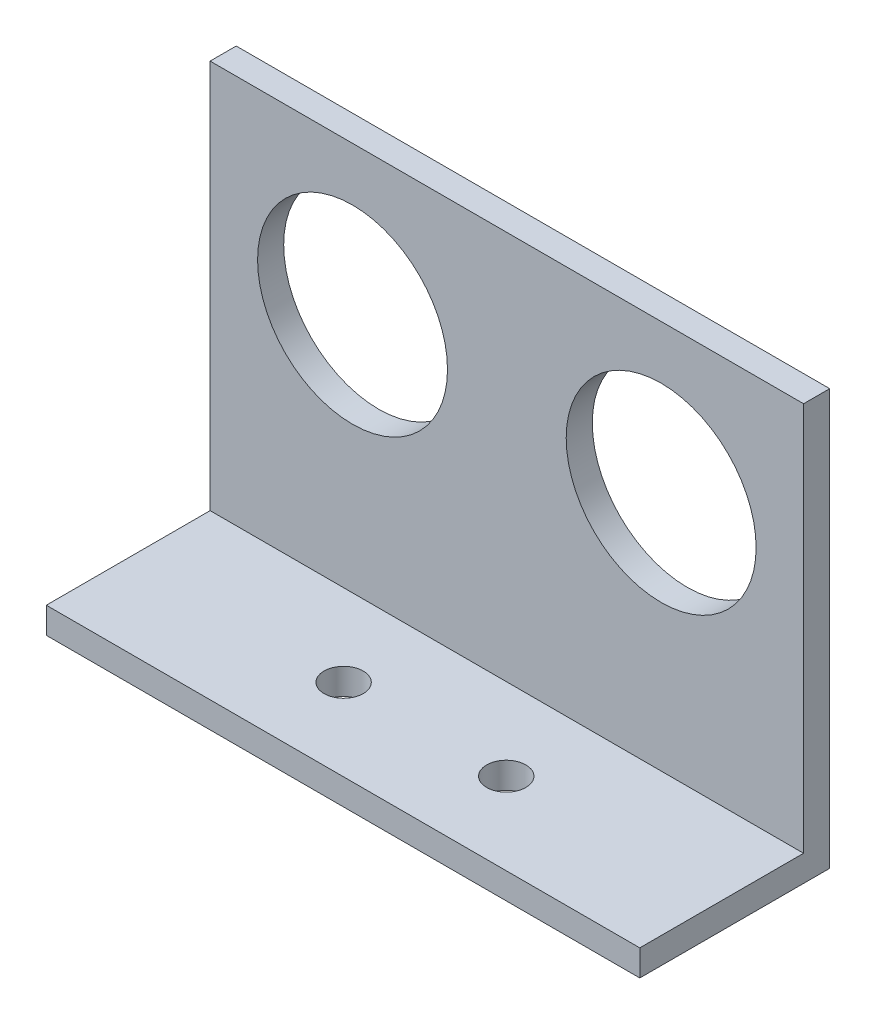
ISO-10303-21;
HEADER;
FILE_DESCRIPTION(('STEP AP214'),'2;1');
FILE_NAME('part.step','',(''),(''),'','','');
FILE_SCHEMA(('AUTOMOTIVE_DESIGN { 1 0 10303 214 1 1 1 1 }'));
ENDSEC;
DATA;
#1=APPLICATION_CONTEXT('core data for automotive mechanical design processes');
#2=APPLICATION_PROTOCOL_DEFINITION('international standard','automotive_design',2000,#1);
#3=PRODUCT_CONTEXT('',#1,'mechanical');
#4=PRODUCT('Part','Part','',(#3));
#5=PRODUCT_RELATED_PRODUCT_CATEGORY('part','',(#4));
#6=PRODUCT_DEFINITION_FORMATION('','',#4);
#7=PRODUCT_DEFINITION_CONTEXT('part definition',#1,'design');
#8=PRODUCT_DEFINITION('design','',#6,#7);
#9=PRODUCT_DEFINITION_SHAPE('','',#8);
#10=(LENGTH_UNIT() NAMED_UNIT(*) SI_UNIT(.MILLI.,.METRE.));
#11=(NAMED_UNIT(*) PLANE_ANGLE_UNIT() SI_UNIT($,.RADIAN.));
#12=(NAMED_UNIT(*) SI_UNIT($,.STERADIAN.) SOLID_ANGLE_UNIT());
#13=UNCERTAINTY_MEASURE_WITH_UNIT(LENGTH_MEASURE(1.E-05),#10,'distance_accuracy_value','');
#14=(GEOMETRIC_REPRESENTATION_CONTEXT(3) GLOBAL_UNCERTAINTY_ASSIGNED_CONTEXT((#13)) GLOBAL_UNIT_ASSIGNED_CONTEXT((#10,
#11,#12)) REPRESENTATION_CONTEXT('',''));
#15=CARTESIAN_POINT('',(0.,0.,0.));
#16=DIRECTION('',(0.,0.,1.));
#17=DIRECTION('',(1.,0.,0.));
#18=AXIS2_PLACEMENT_3D('',#15,#16,#17);
#19=CARTESIAN_POINT('',(0.,35.,2.2));
#20=DIRECTION('',(1.,0.,0.));
#21=DIRECTION('',(0.,0.,-1.));
#22=AXIS2_PLACEMENT_3D('',#19,#20,#21);
#23=PLANE('',#22);
#24=DIRECTION('',(0.,-1.,0.));
#25=VECTOR('',#24,1.);
#26=CARTESIAN_POINT('',(0.,35.,0.));
#27=LINE('',#26,#25);
#28=CARTESIAN_POINT('',(0.,35.,0.));
#29=VERTEX_POINT('',#28);
#30=CARTESIAN_POINT('',(0.,0.,0.));
#31=VERTEX_POINT('',#30);
#32=EDGE_CURVE('E96',#29,#31,#27,.T.);
#33=ORIENTED_EDGE('',*,*,#32,.T.);
#34=DIRECTION('',(0.,0.,-1.));
#35=VECTOR('',#34,1.);
#36=CARTESIAN_POINT('',(0.,0.,2.2));
#37=LINE('',#36,#35);
#38=CARTESIAN_POINT('',(0.,0.,16.));
#39=VERTEX_POINT('',#38);
#40=EDGE_CURVE('E11',#39,#31,#37,.T.);
#41=ORIENTED_EDGE('',*,*,#40,.F.);
#42=DIRECTION('',(0.,-1.,0.));
#43=VECTOR('',#42,1.);
#44=CARTESIAN_POINT('',(0.,0.,16.));
#45=LINE('',#44,#43);
#46=CARTESIAN_POINT('',(0.,2.2,16.));
#47=VERTEX_POINT('',#46);
#48=EDGE_CURVE('E142',#47,#39,#45,.T.);
#49=ORIENTED_EDGE('',*,*,#48,.F.);
#50=DIRECTION('',(0.,0.,-1.));
#51=VECTOR('',#50,1.);
#52=CARTESIAN_POINT('',(0.,2.2,16.));
#53=LINE('',#52,#51);
#54=CARTESIAN_POINT('',(0.,2.2,2.2));
#55=VERTEX_POINT('',#54);
#56=EDGE_CURVE('E149',#47,#55,#53,.T.);
#57=ORIENTED_EDGE('',*,*,#56,.T.);
#58=DIRECTION('',(0.,-1.,0.));
#59=VECTOR('',#58,1.);
#60=CARTESIAN_POINT('',(0.,35.,2.2));
#61=LINE('',#60,#59);
#62=CARTESIAN_POINT('',(0.,35.,2.2));
#63=VERTEX_POINT('',#62);
#64=EDGE_CURVE('E90',#63,#55,#61,.T.);
#65=ORIENTED_EDGE('',*,*,#64,.F.);
#66=DIRECTION('',(0.,0.,-1.));
#67=VECTOR('',#66,1.);
#68=CARTESIAN_POINT('',(0.,35.,2.2));
#69=LINE('',#68,#67);
#70=EDGE_CURVE('E82',#63,#29,#69,.T.);
#71=ORIENTED_EDGE('',*,*,#70,.T.);
#72=EDGE_LOOP('',(#33,#41,#49,#57,#65,#71));
#73=FACE_BOUND('',#72,.T.);
#74=ADVANCED_FACE('F39',(#73),#23,.F.);
#75=CARTESIAN_POINT('',(0.,0.,2.2));
#76=DIRECTION('',(0.,1.,0.));
#77=DIRECTION('',(0.,0.,1.));
#78=AXIS2_PLACEMENT_3D('',#75,#76,#77);
#79=PLANE('',#78);
#80=CARTESIAN_POINT('',(18.15,0.,9.1));
#81=DIRECTION('',(0.,1.,0.));
#82=DIRECTION('',(0.,0.,1.));
#83=AXIS2_PLACEMENT_3D('',#80,#81,#82);
#84=CIRCLE('',#83,1.65);
#85=CARTESIAN_POINT('',(18.15,0.,10.75));
#86=VERTEX_POINT('',#85);
#87=EDGE_CURVE('E159',#86,#86,#84,.T.);
#88=ORIENTED_EDGE('',*,*,#87,.T.);
#89=EDGE_LOOP('',(#88));
#90=FACE_BOUND('',#89,.T.);
#91=CARTESIAN_POINT('',(31.85,0.,9.1));
#92=DIRECTION('',(0.,1.,0.));
#93=DIRECTION('',(0.,0.,1.));
#94=AXIS2_PLACEMENT_3D('',#91,#92,#93);
#95=CIRCLE('',#94,1.65);
#96=CARTESIAN_POINT('',(31.85,0.,10.75));
#97=VERTEX_POINT('',#96);
#98=EDGE_CURVE('E295',#97,#97,#95,.T.);
#99=ORIENTED_EDGE('',*,*,#98,.T.);
#100=EDGE_LOOP('',(#99));
#101=FACE_BOUND('',#100,.T.);
#102=DIRECTION('',(1.,0.,0.));
#103=VECTOR('',#102,1.);
#104=CARTESIAN_POINT('',(0.,0.,0.));
#105=LINE('',#104,#103);
#106=CARTESIAN_POINT('',(50.,0.,0.));
#107=VERTEX_POINT('',#106);
#108=EDGE_CURVE('E101',#31,#107,#105,.T.);
#109=ORIENTED_EDGE('',*,*,#108,.T.);
#110=DIRECTION('',(0.,0.,-1.));
#111=VECTOR('',#110,1.);
#112=CARTESIAN_POINT('',(50.,0.,2.2));
#113=LINE('',#112,#111);
#114=CARTESIAN_POINT('',(50.,0.,16.));
#115=VERTEX_POINT('',#114);
#116=EDGE_CURVE('E47',#115,#107,#113,.T.);
#117=ORIENTED_EDGE('',*,*,#116,.F.);
#118=DIRECTION('',(1.,0.,0.));
#119=VECTOR('',#118,1.);
#120=CARTESIAN_POINT('',(50.,0.,16.));
#121=LINE('',#120,#119);
#122=EDGE_CURVE('E131',#39,#115,#121,.T.);
#123=ORIENTED_EDGE('',*,*,#122,.F.);
#124=ORIENTED_EDGE('',*,*,#40,.T.);
#125=EDGE_LOOP('',(#109,#117,#123,#124));
#126=FACE_BOUND('',#125,.T.);
#127=ADVANCED_FACE('F130',(#90,#101,#126),#79,.F.);
#128=CARTESIAN_POINT('',(50.,0.,2.2));
#129=DIRECTION('',(-1.,0.,0.));
#130=DIRECTION('',(0.,0.,1.));
#131=AXIS2_PLACEMENT_3D('',#128,#129,#130);
#132=PLANE('',#131);
#133=DIRECTION('',(0.,1.,0.));
#134=VECTOR('',#133,1.);
#135=CARTESIAN_POINT('',(50.,0.,0.));
#136=LINE('',#135,#134);
#137=CARTESIAN_POINT('',(50.,35.,0.));
#138=VERTEX_POINT('',#137);
#139=EDGE_CURVE('E91',#107,#138,#136,.T.);
#140=ORIENTED_EDGE('',*,*,#139,.T.);
#141=DIRECTION('',(0.,0.,-1.));
#142=VECTOR('',#141,1.);
#143=CARTESIAN_POINT('',(50.,35.,2.2));
#144=LINE('',#143,#142);
#145=CARTESIAN_POINT('',(50.,35.,2.2));
#146=VERTEX_POINT('',#145);
#147=EDGE_CURVE('E85',#146,#138,#144,.T.);
#148=ORIENTED_EDGE('',*,*,#147,.F.);
#149=DIRECTION('',(0.,1.,0.));
#150=VECTOR('',#149,1.);
#151=CARTESIAN_POINT('',(50.,0.,2.2));
#152=LINE('',#151,#150);
#153=CARTESIAN_POINT('',(50.,2.2,2.2));
#154=VERTEX_POINT('',#153);
#155=EDGE_CURVE('E176',#154,#146,#152,.T.);
#156=ORIENTED_EDGE('',*,*,#155,.F.);
#157=DIRECTION('',(0.,0.,-1.));
#158=VECTOR('',#157,1.);
#159=CARTESIAN_POINT('',(50.,2.2,16.));
#160=LINE('',#159,#158);
#161=CARTESIAN_POINT('',(50.,2.2,16.));
#162=VERTEX_POINT('',#161);
#163=EDGE_CURVE('E153',#162,#154,#160,.T.);
#164=ORIENTED_EDGE('',*,*,#163,.F.);
#165=DIRECTION('',(0.,1.,0.));
#166=VECTOR('',#165,1.);
#167=CARTESIAN_POINT('',(50.,2.2,16.));
#168=LINE('',#167,#166);
#169=EDGE_CURVE('E126',#115,#162,#168,.T.);
#170=ORIENTED_EDGE('',*,*,#169,.F.);
#171=ORIENTED_EDGE('',*,*,#116,.T.);
#172=EDGE_LOOP('',(#140,#148,#156,#164,#170,#171));
#173=FACE_BOUND('',#172,.T.);
#174=ADVANCED_FACE('F122',(#173),#132,.F.);
#175=CARTESIAN_POINT('',(50.,35.,2.2));
#176=DIRECTION('',(0.,-1.,0.));
#177=DIRECTION('',(1.,0.,0.));
#178=AXIS2_PLACEMENT_3D('',#175,#176,#177);
#179=PLANE('',#178);
#180=DIRECTION('',(-1.,0.,0.));
#181=VECTOR('',#180,1.);
#182=CARTESIAN_POINT('',(50.,35.,0.));
#183=LINE('',#182,#181);
#184=EDGE_CURVE('E79',#138,#29,#183,.T.);
#185=ORIENTED_EDGE('',*,*,#184,.T.);
#186=ORIENTED_EDGE('',*,*,#70,.F.);
#187=DIRECTION('',(-1.,0.,0.));
#188=VECTOR('',#187,1.);
#189=CARTESIAN_POINT('',(50.,35.,2.2));
#190=LINE('',#189,#188);
#191=EDGE_CURVE('E60',#146,#63,#190,.T.);
#192=ORIENTED_EDGE('',*,*,#191,.F.);
#193=ORIENTED_EDGE('',*,*,#147,.T.);
#194=EDGE_LOOP('',(#185,#186,#192,#193));
#195=FACE_BOUND('',#194,.T.);
#196=ADVANCED_FACE('F81',(#195),#179,.F.);
#197=CARTESIAN_POINT('',(0.,0.,2.2));
#198=DIRECTION('',(0.,0.,1.));
#199=DIRECTION('',(1.,0.,0.));
#200=AXIS2_PLACEMENT_3D('',#197,#198,#199);
#201=PLANE('',#200);
#202=DIRECTION('',(-1.,0.,0.));
#203=VECTOR('',#202,1.);
#204=CARTESIAN_POINT('',(0.,2.2,2.2));
#205=LINE('',#204,#203);
#206=EDGE_CURVE('E54',#154,#55,#205,.T.);
#207=ORIENTED_EDGE('',*,*,#206,.F.);
#208=ORIENTED_EDGE('',*,*,#155,.T.);
#209=ORIENTED_EDGE('',*,*,#191,.T.);
#210=ORIENTED_EDGE('',*,*,#64,.T.);
#211=EDGE_LOOP('',(#207,#208,#209,#210));
#212=FACE_BOUND('',#211,.T.);
#213=CARTESIAN_POINT('',(12.,22.5,2.2));
#214=DIRECTION('',(0.,0.,1.));
#215=DIRECTION('',(1.,0.,0.));
#216=AXIS2_PLACEMENT_3D('',#213,#214,#215);
#217=CIRCLE('',#216,8.);
#218=CARTESIAN_POINT('',(20.,22.5,2.2));
#219=VERTEX_POINT('',#218);
#220=EDGE_CURVE('E109',#219,#219,#217,.T.);
#221=ORIENTED_EDGE('',*,*,#220,.F.);
#222=EDGE_LOOP('',(#221));
#223=FACE_BOUND('',#222,.T.);
#224=CARTESIAN_POINT('',(38.,22.5,2.2));
#225=DIRECTION('',(0.,0.,1.));
#226=DIRECTION('',(1.,0.,0.));
#227=AXIS2_PLACEMENT_3D('',#224,#225,#226);
#228=CIRCLE('',#227,8.);
#229=CARTESIAN_POINT('',(46.,22.5,2.2));
#230=VERTEX_POINT('',#229);
#231=EDGE_CURVE('E163',#230,#230,#228,.T.);
#232=ORIENTED_EDGE('',*,*,#231,.F.);
#233=EDGE_LOOP('',(#232));
#234=FACE_BOUND('',#233,.T.);
#235=ADVANCED_FACE('F179',(#212,#223,#234),#201,.T.);
#236=CARTESIAN_POINT('',(0.,0.,0.));
#237=DIRECTION('',(0.,0.,1.));
#238=DIRECTION('',(1.,0.,0.));
#239=AXIS2_PLACEMENT_3D('',#236,#237,#238);
#240=PLANE('',#239);
#241=CARTESIAN_POINT('',(12.,22.5,0.));
#242=DIRECTION('',(0.,0.,1.));
#243=DIRECTION('',(1.,0.,0.));
#244=AXIS2_PLACEMENT_3D('',#241,#242,#243);
#245=CIRCLE('',#244,8.);
#246=CARTESIAN_POINT('',(20.,22.5,0.));
#247=VERTEX_POINT('',#246);
#248=EDGE_CURVE('E103',#247,#247,#245,.T.);
#249=ORIENTED_EDGE('',*,*,#248,.T.);
#250=EDGE_LOOP('',(#249));
#251=FACE_BOUND('',#250,.T.);
#252=CARTESIAN_POINT('',(38.,22.5,0.));
#253=DIRECTION('',(0.,0.,1.));
#254=DIRECTION('',(1.,0.,0.));
#255=AXIS2_PLACEMENT_3D('',#252,#253,#254);
#256=CIRCLE('',#255,8.);
#257=CARTESIAN_POINT('',(46.,22.5,0.));
#258=VERTEX_POINT('',#257);
#259=EDGE_CURVE('E168',#258,#258,#256,.T.);
#260=ORIENTED_EDGE('',*,*,#259,.T.);
#261=EDGE_LOOP('',(#260));
#262=FACE_BOUND('',#261,.T.);
#263=ORIENTED_EDGE('',*,*,#32,.F.);
#264=ORIENTED_EDGE('',*,*,#184,.F.);
#265=ORIENTED_EDGE('',*,*,#139,.F.);
#266=ORIENTED_EDGE('',*,*,#108,.F.);
#267=EDGE_LOOP('',(#263,#264,#265,#266));
#268=FACE_BOUND('',#267,.T.);
#269=ADVANCED_FACE('F100',(#251,#262,#268),#240,.F.);
#270=CARTESIAN_POINT('',(38.,22.5,0.));
#271=DIRECTION('',(0.,0.,1.));
#272=DIRECTION('',(1.,0.,0.));
#273=AXIS2_PLACEMENT_3D('',#270,#271,#272);
#274=CYLINDRICAL_SURFACE('',#273,8.);
#275=ORIENTED_EDGE('',*,*,#259,.F.);
#276=EDGE_LOOP('',(#275));
#277=FACE_BOUND('',#276,.T.);
#278=ORIENTED_EDGE('',*,*,#231,.T.);
#279=EDGE_LOOP('',(#278));
#280=FACE_BOUND('',#279,.T.);
#281=ADVANCED_FACE('F193',(#277,#280),#274,.F.);
#282=CARTESIAN_POINT('',(12.,22.5,0.));
#283=DIRECTION('',(0.,0.,1.));
#284=DIRECTION('',(1.,0.,0.));
#285=AXIS2_PLACEMENT_3D('',#282,#283,#284);
#286=CYLINDRICAL_SURFACE('',#285,8.);
#287=ORIENTED_EDGE('',*,*,#248,.F.);
#288=EDGE_LOOP('',(#287));
#289=FACE_BOUND('',#288,.T.);
#290=ORIENTED_EDGE('',*,*,#220,.T.);
#291=EDGE_LOOP('',(#290));
#292=FACE_BOUND('',#291,.T.);
#293=ADVANCED_FACE('F184',(#289,#292),#286,.F.);
#294=CARTESIAN_POINT('',(0.,2.2,16.));
#295=DIRECTION('',(0.,-1.,0.));
#296=DIRECTION('',(0.,0.,-1.));
#297=AXIS2_PLACEMENT_3D('',#294,#295,#296);
#298=PLANE('',#297);
#299=CARTESIAN_POINT('',(18.15,2.2,9.1));
#300=DIRECTION('',(0.,1.,0.));
#301=DIRECTION('',(0.,0.,1.));
#302=AXIS2_PLACEMENT_3D('',#299,#300,#301);
#303=CIRCLE('',#302,1.65);
#304=CARTESIAN_POINT('',(18.15,2.2,10.75));
#305=VERTEX_POINT('',#304);
#306=EDGE_CURVE('E292',#305,#305,#303,.T.);
#307=ORIENTED_EDGE('',*,*,#306,.F.);
#308=EDGE_LOOP('',(#307));
#309=FACE_BOUND('',#308,.T.);
#310=CARTESIAN_POINT('',(31.85,2.2,9.1));
#311=DIRECTION('',(0.,1.,0.));
#312=DIRECTION('',(0.,0.,1.));
#313=AXIS2_PLACEMENT_3D('',#310,#311,#312);
#314=CIRCLE('',#313,1.65);
#315=CARTESIAN_POINT('',(31.85,2.2,10.75));
#316=VERTEX_POINT('',#315);
#317=EDGE_CURVE('E304',#316,#316,#314,.T.);
#318=ORIENTED_EDGE('',*,*,#317,.F.);
#319=EDGE_LOOP('',(#318));
#320=FACE_BOUND('',#319,.T.);
#321=ORIENTED_EDGE('',*,*,#206,.T.);
#322=ORIENTED_EDGE('',*,*,#56,.F.);
#323=DIRECTION('',(-1.,0.,0.));
#324=VECTOR('',#323,1.);
#325=CARTESIAN_POINT('',(0.,2.2,16.));
#326=LINE('',#325,#324);
#327=EDGE_CURVE('E146',#162,#47,#326,.T.);
#328=ORIENTED_EDGE('',*,*,#327,.F.);
#329=ORIENTED_EDGE('',*,*,#163,.T.);
#330=EDGE_LOOP('',(#321,#322,#328,#329));
#331=FACE_BOUND('',#330,.T.);
#332=ADVANCED_FACE('F182',(#309,#320,#331),#298,.F.);
#333=CARTESIAN_POINT('',(0.,0.,16.));
#334=DIRECTION('',(0.,0.,-1.));
#335=DIRECTION('',(-1.,0.,0.));
#336=AXIS2_PLACEMENT_3D('',#333,#334,#335);
#337=PLANE('',#336);
#338=ORIENTED_EDGE('',*,*,#122,.T.);
#339=ORIENTED_EDGE('',*,*,#169,.T.);
#340=ORIENTED_EDGE('',*,*,#327,.T.);
#341=ORIENTED_EDGE('',*,*,#48,.T.);
#342=EDGE_LOOP('',(#338,#339,#340,#341));
#343=FACE_BOUND('',#342,.T.);
#344=ADVANCED_FACE('F144',(#343),#337,.F.);
#345=CARTESIAN_POINT('',(31.85,-11.6,9.1));
#346=DIRECTION('',(0.,1.,0.));
#347=DIRECTION('',(0.,0.,1.));
#348=AXIS2_PLACEMENT_3D('',#345,#346,#347);
#349=CYLINDRICAL_SURFACE('',#348,1.65);
#350=CARTESIAN_POINT('',(31.85,2.2,10.75));
#351=CARTESIAN_POINT('',(31.85,2.17708333333333,10.75));
#352=CARTESIAN_POINT('',(31.85,2.15416666666667,10.75));
#353=CARTESIAN_POINT('',(31.85,2.10833333333333,10.75));
#354=CARTESIAN_POINT('',(31.85,2.08541666666667,10.75));
#355=CARTESIAN_POINT('',(31.85,2.03958333333333,10.75));
#356=CARTESIAN_POINT('',(31.85,2.01666666666667,10.75));
#357=CARTESIAN_POINT('',(31.85,1.97083333333333,10.75));
#358=CARTESIAN_POINT('',(31.85,1.94791666666667,10.75));
#359=CARTESIAN_POINT('',(31.85,1.90208333333333,10.75));
#360=CARTESIAN_POINT('',(31.85,1.87916666666667,10.75));
#361=CARTESIAN_POINT('',(31.85,1.83333333333333,10.75));
#362=CARTESIAN_POINT('',(31.85,1.81041666666667,10.75));
#363=CARTESIAN_POINT('',(31.85,1.76458333333333,10.75));
#364=CARTESIAN_POINT('',(31.85,1.74166666666667,10.75));
#365=CARTESIAN_POINT('',(31.85,1.69583333333333,10.75));
#366=CARTESIAN_POINT('',(31.85,1.67291666666667,10.75));
#367=CARTESIAN_POINT('',(31.85,1.62708333333333,10.75));
#368=CARTESIAN_POINT('',(31.85,1.60416666666667,10.75));
#369=CARTESIAN_POINT('',(31.85,1.55833333333333,10.75));
#370=CARTESIAN_POINT('',(31.85,1.53541666666667,10.75));
#371=CARTESIAN_POINT('',(31.85,1.48958333333333,10.75));
#372=CARTESIAN_POINT('',(31.85,1.46666666666667,10.75));
#373=CARTESIAN_POINT('',(31.85,1.42083333333333,10.75));
#374=CARTESIAN_POINT('',(31.85,1.39791666666667,10.75));
#375=CARTESIAN_POINT('',(31.85,1.35208333333333,10.75));
#376=CARTESIAN_POINT('',(31.85,1.32916666666667,10.75));
#377=CARTESIAN_POINT('',(31.85,1.28333333333333,10.75));
#378=CARTESIAN_POINT('',(31.85,1.26041666666667,10.75));
#379=CARTESIAN_POINT('',(31.85,1.21458333333333,10.75));
#380=CARTESIAN_POINT('',(31.85,1.19166666666667,10.75));
#381=CARTESIAN_POINT('',(31.85,1.14583333333333,10.75));
#382=CARTESIAN_POINT('',(31.85,1.12291666666667,10.75));
#383=CARTESIAN_POINT('',(31.85,1.07708333333333,10.75));
#384=CARTESIAN_POINT('',(31.85,1.05416666666667,10.75));
#385=CARTESIAN_POINT('',(31.85,1.00833333333333,10.75));
#386=CARTESIAN_POINT('',(31.85,0.985416666666667,10.75));
#387=CARTESIAN_POINT('',(31.85,0.939583333333333,10.75));
#388=CARTESIAN_POINT('',(31.85,0.916666666666667,10.75));
#389=CARTESIAN_POINT('',(31.85,0.870833333333333,10.75));
#390=CARTESIAN_POINT('',(31.85,0.847916666666666,10.75));
#391=CARTESIAN_POINT('',(31.85,0.802083333333333,10.75));
#392=CARTESIAN_POINT('',(31.85,0.779166666666666,10.75));
#393=CARTESIAN_POINT('',(31.85,0.733333333333334,10.75));
#394=CARTESIAN_POINT('',(31.85,0.710416666666667,10.75));
#395=CARTESIAN_POINT('',(31.85,0.664583333333334,10.75));
#396=CARTESIAN_POINT('',(31.85,0.641666666666667,10.75));
#397=CARTESIAN_POINT('',(31.85,0.595833333333333,10.75));
#398=CARTESIAN_POINT('',(31.85,0.572916666666667,10.75));
#399=CARTESIAN_POINT('',(31.85,0.527083333333334,10.75));
#400=CARTESIAN_POINT('',(31.85,0.504166666666667,10.75));
#401=CARTESIAN_POINT('',(31.85,0.458333333333334,10.75));
#402=CARTESIAN_POINT('',(31.85,0.435416666666667,10.75));
#403=CARTESIAN_POINT('',(31.85,0.389583333333333,10.75));
#404=CARTESIAN_POINT('',(31.85,0.366666666666667,10.75));
#405=CARTESIAN_POINT('',(31.85,0.320833333333334,10.75));
#406=CARTESIAN_POINT('',(31.85,0.297916666666667,10.75));
#407=CARTESIAN_POINT('',(31.85,0.252083333333334,10.75));
#408=CARTESIAN_POINT('',(31.85,0.229166666666667,10.75));
#409=CARTESIAN_POINT('',(31.85,0.183333333333333,10.75));
#410=CARTESIAN_POINT('',(31.85,0.160416666666667,10.75));
#411=CARTESIAN_POINT('',(31.85,0.114583333333333,10.75));
#412=CARTESIAN_POINT('',(31.85,0.0916666666666664,10.75));
#413=CARTESIAN_POINT('',(31.85,0.0458333333333329,10.75));
#414=CARTESIAN_POINT('',(31.85,0.0229166666666664,10.75));
#415=CARTESIAN_POINT('',(31.85,0.,10.75));
#416=B_SPLINE_CURVE_WITH_KNOTS('',3,(#350,#351,#352,#353,#354,#355,#356,#357,#358,#359,#360,
#361,#362,#363,#364,#365,#366,#367,#368,#369,#370,#371,#372,#373,#374,#375,#376,#377,#378,#379,
#380,#381,#382,#383,#384,#385,#386,#387,#388,#389,#390,#391,#392,#393,#394,#395,#396,#397,#398,
#399,#400,#401,#402,#403,#404,#405,#406,#407,#408,#409,#410,#411,#412,#413,#414,#415),
.UNSPECIFIED.,.F.,.F.,(4,2,2,2,2,2,2,2,2,2,2,2,2,2,2,2,2,2,2,2,2,2,2,2,2,2,2,2,2,2,2,2,4),(0.,
0.0687499999999994,0.1375,0.20625,0.275000000000001,0.34375,0.4125,0.481250000000001,0.55,
0.618749999999999,0.687500000000001,0.75625,0.824999999999999,0.89375,0.9625,1.03125,1.1,
1.16875,1.2375,1.30625,1.375,1.44375,1.5125,1.58125,1.65,1.71875,1.7875,1.85625,1.925,1.99375,
2.0625,2.13125,2.2),.UNSPECIFIED.);
#417=EDGE_CURVE('BSEAM191',#316,#97,#416,.T.);
#418=ORIENTED_EDGE('',*,*,#317,.T.);
#419=ORIENTED_EDGE('',*,*,#98,.F.);
#420=ORIENTED_EDGE('',*,*,#417,.T.);
#421=ORIENTED_EDGE('',*,*,#417,.F.);
#422=EDGE_LOOP('',(#418,#420,#419,#421));
#423=FACE_BOUND('',#422,.T.);
#424=ADVANCED_FACE('F191',(#423),#349,.F.);
#425=CARTESIAN_POINT('',(18.15,-11.6,9.1));
#426=DIRECTION('',(0.,1.,0.));
#427=DIRECTION('',(0.,0.,1.));
#428=AXIS2_PLACEMENT_3D('',#425,#426,#427);
#429=CYLINDRICAL_SURFACE('',#428,1.65);
#430=CARTESIAN_POINT('',(18.15,2.2,10.75));
#431=CARTESIAN_POINT('',(18.15,2.17708333333333,10.75));
#432=CARTESIAN_POINT('',(18.15,2.15416666666667,10.75));
#433=CARTESIAN_POINT('',(18.15,2.10833333333333,10.75));
#434=CARTESIAN_POINT('',(18.15,2.08541666666667,10.75));
#435=CARTESIAN_POINT('',(18.15,2.03958333333333,10.75));
#436=CARTESIAN_POINT('',(18.15,2.01666666666667,10.75));
#437=CARTESIAN_POINT('',(18.15,1.97083333333333,10.75));
#438=CARTESIAN_POINT('',(18.15,1.94791666666667,10.75));
#439=CARTESIAN_POINT('',(18.15,1.90208333333333,10.75));
#440=CARTESIAN_POINT('',(18.15,1.87916666666667,10.75));
#441=CARTESIAN_POINT('',(18.15,1.83333333333333,10.75));
#442=CARTESIAN_POINT('',(18.15,1.81041666666667,10.75));
#443=CARTESIAN_POINT('',(18.15,1.76458333333333,10.75));
#444=CARTESIAN_POINT('',(18.15,1.74166666666667,10.75));
#445=CARTESIAN_POINT('',(18.15,1.69583333333333,10.75));
#446=CARTESIAN_POINT('',(18.15,1.67291666666667,10.75));
#447=CARTESIAN_POINT('',(18.15,1.62708333333333,10.75));
#448=CARTESIAN_POINT('',(18.15,1.60416666666667,10.75));
#449=CARTESIAN_POINT('',(18.15,1.55833333333333,10.75));
#450=CARTESIAN_POINT('',(18.15,1.53541666666667,10.75));
#451=CARTESIAN_POINT('',(18.15,1.48958333333333,10.75));
#452=CARTESIAN_POINT('',(18.15,1.46666666666667,10.75));
#453=CARTESIAN_POINT('',(18.15,1.42083333333333,10.75));
#454=CARTESIAN_POINT('',(18.15,1.39791666666667,10.75));
#455=CARTESIAN_POINT('',(18.15,1.35208333333333,10.75));
#456=CARTESIAN_POINT('',(18.15,1.32916666666667,10.75));
#457=CARTESIAN_POINT('',(18.15,1.28333333333333,10.75));
#458=CARTESIAN_POINT('',(18.15,1.26041666666667,10.75));
#459=CARTESIAN_POINT('',(18.15,1.21458333333333,10.75));
#460=CARTESIAN_POINT('',(18.15,1.19166666666667,10.75));
#461=CARTESIAN_POINT('',(18.15,1.14583333333333,10.75));
#462=CARTESIAN_POINT('',(18.15,1.12291666666667,10.75));
#463=CARTESIAN_POINT('',(18.15,1.07708333333333,10.75));
#464=CARTESIAN_POINT('',(18.15,1.05416666666667,10.75));
#465=CARTESIAN_POINT('',(18.15,1.00833333333333,10.75));
#466=CARTESIAN_POINT('',(18.15,0.985416666666667,10.75));
#467=CARTESIAN_POINT('',(18.15,0.939583333333333,10.75));
#468=CARTESIAN_POINT('',(18.15,0.916666666666667,10.75));
#469=CARTESIAN_POINT('',(18.15,0.870833333333333,10.75));
#470=CARTESIAN_POINT('',(18.15,0.847916666666666,10.75));
#471=CARTESIAN_POINT('',(18.15,0.802083333333333,10.75));
#472=CARTESIAN_POINT('',(18.15,0.779166666666666,10.75));
#473=CARTESIAN_POINT('',(18.15,0.733333333333334,10.75));
#474=CARTESIAN_POINT('',(18.15,0.710416666666667,10.75));
#475=CARTESIAN_POINT('',(18.15,0.664583333333334,10.75));
#476=CARTESIAN_POINT('',(18.15,0.641666666666667,10.75));
#477=CARTESIAN_POINT('',(18.15,0.595833333333333,10.75));
#478=CARTESIAN_POINT('',(18.15,0.572916666666667,10.75));
#479=CARTESIAN_POINT('',(18.15,0.527083333333334,10.75));
#480=CARTESIAN_POINT('',(18.15,0.504166666666667,10.75));
#481=CARTESIAN_POINT('',(18.15,0.458333333333334,10.75));
#482=CARTESIAN_POINT('',(18.15,0.435416666666667,10.75));
#483=CARTESIAN_POINT('',(18.15,0.389583333333333,10.75));
#484=CARTESIAN_POINT('',(18.15,0.366666666666667,10.75));
#485=CARTESIAN_POINT('',(18.15,0.320833333333334,10.75));
#486=CARTESIAN_POINT('',(18.15,0.297916666666667,10.75));
#487=CARTESIAN_POINT('',(18.15,0.252083333333334,10.75));
#488=CARTESIAN_POINT('',(18.15,0.229166666666667,10.75));
#489=CARTESIAN_POINT('',(18.15,0.183333333333333,10.75));
#490=CARTESIAN_POINT('',(18.15,0.160416666666667,10.75));
#491=CARTESIAN_POINT('',(18.15,0.114583333333333,10.75));
#492=CARTESIAN_POINT('',(18.15,0.0916666666666664,10.75));
#493=CARTESIAN_POINT('',(18.15,0.0458333333333329,10.75));
#494=CARTESIAN_POINT('',(18.15,0.0229166666666664,10.75));
#495=CARTESIAN_POINT('',(18.15,0.,10.75));
#496=B_SPLINE_CURVE_WITH_KNOTS('',3,(#430,#431,#432,#433,#434,#435,#436,#437,#438,#439,#440,
#441,#442,#443,#444,#445,#446,#447,#448,#449,#450,#451,#452,#453,#454,#455,#456,#457,#458,#459,
#460,#461,#462,#463,#464,#465,#466,#467,#468,#469,#470,#471,#472,#473,#474,#475,#476,#477,#478,
#479,#480,#481,#482,#483,#484,#485,#486,#487,#488,#489,#490,#491,#492,#493,#494,#495),
.UNSPECIFIED.,.F.,.F.,(4,2,2,2,2,2,2,2,2,2,2,2,2,2,2,2,2,2,2,2,2,2,2,2,2,2,2,2,2,2,2,2,4),(0.,
0.0687499999999994,0.1375,0.20625,0.275000000000001,0.34375,0.4125,0.481250000000001,0.55,
0.618749999999999,0.687500000000001,0.75625,0.824999999999999,0.89375,0.9625,1.03125,1.1,
1.16875,1.2375,1.30625,1.375,1.44375,1.5125,1.58125,1.65,1.71875,1.7875,1.85625,1.925,1.99375,
2.0625,2.13125,2.2),.UNSPECIFIED.);
#497=EDGE_CURVE('BSEAM276',#305,#86,#496,.T.);
#498=ORIENTED_EDGE('',*,*,#306,.T.);
#499=ORIENTED_EDGE('',*,*,#87,.F.);
#500=ORIENTED_EDGE('',*,*,#497,.T.);
#501=ORIENTED_EDGE('',*,*,#497,.F.);
#502=EDGE_LOOP('',(#498,#500,#499,#501));
#503=FACE_BOUND('',#502,.T.);
#504=ADVANCED_FACE('F276',(#503),#429,.F.);
#505=CLOSED_SHELL('',(#74,#127,#174,#196,#235,#269,#281,#293,#332,#344,#424,#504));
#506=MANIFOLD_SOLID_BREP('B2',#505);
#507=ADVANCED_BREP_SHAPE_REPRESENTATION('',(#18,#506),#14);
#508=SHAPE_DEFINITION_REPRESENTATION(#9,#507);
ENDSEC;
END-ISO-10303-21;
